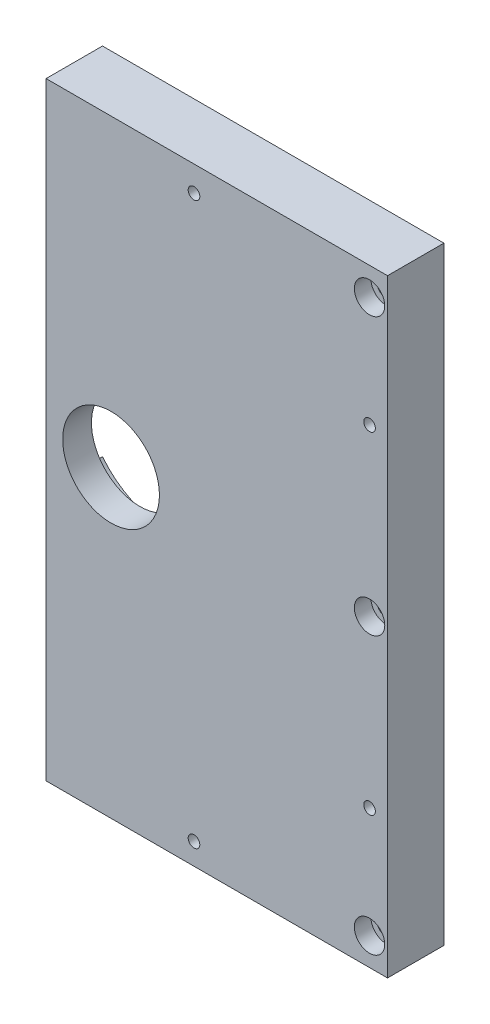
ISO-10303-21;
HEADER;
FILE_DESCRIPTION(('STEP AP214'),'2;1');
FILE_NAME('part.step','',(''),(''),'','','');
FILE_SCHEMA(('AUTOMOTIVE_DESIGN { 1 0 10303 214 1 1 1 1 }'));
ENDSEC;
DATA;
#1=APPLICATION_CONTEXT('core data for automotive mechanical design processes');
#2=APPLICATION_PROTOCOL_DEFINITION('international standard','automotive_design',2000,#1);
#3=PRODUCT_CONTEXT('',#1,'mechanical');
#4=PRODUCT('Part','Part','',(#3));
#5=PRODUCT_RELATED_PRODUCT_CATEGORY('part','',(#4));
#6=PRODUCT_DEFINITION_FORMATION('','',#4);
#7=PRODUCT_DEFINITION_CONTEXT('part definition',#1,'design');
#8=PRODUCT_DEFINITION('design','',#6,#7);
#9=PRODUCT_DEFINITION_SHAPE('','',#8);
#10=(LENGTH_UNIT() NAMED_UNIT(*) SI_UNIT(.MILLI.,.METRE.));
#11=(NAMED_UNIT(*) PLANE_ANGLE_UNIT() SI_UNIT($,.RADIAN.));
#12=(NAMED_UNIT(*) SI_UNIT($,.STERADIAN.) SOLID_ANGLE_UNIT());
#13=UNCERTAINTY_MEASURE_WITH_UNIT(LENGTH_MEASURE(1.E-05),#10,'distance_accuracy_value','');
#14=(GEOMETRIC_REPRESENTATION_CONTEXT(3) GLOBAL_UNCERTAINTY_ASSIGNED_CONTEXT((#13)) GLOBAL_UNIT_ASSIGNED_CONTEXT((#10,
#11,#12)) REPRESENTATION_CONTEXT('',''));
#15=CARTESIAN_POINT('',(0.,0.,0.));
#16=DIRECTION('',(0.,0.,1.));
#17=DIRECTION('',(1.,0.,0.));
#18=AXIS2_PLACEMENT_3D('',#15,#16,#17);
#19=CARTESIAN_POINT('',(0.,0.,20.3999999999999));
#20=DIRECTION('',(0.,0.,-1.));
#21=DIRECTION('',(-1.,0.,0.));
#22=AXIS2_PLACEMENT_3D('',#19,#20,#21);
#23=CYLINDRICAL_SURFACE('',#22,30.);
#24=CARTESIAN_POINT('',(0.,0.,9.99999999999999));
#25=DIRECTION('',(0.,0.,1.));
#26=DIRECTION('',(1.,0.,0.));
#27=AXIS2_PLACEMENT_3D('',#24,#25,#26);
#28=CIRCLE('',#27,30.);
#29=CARTESIAN_POINT('',(-23.5,-18.6480561989715,9.99999999999999));
#30=VERTEX_POINT('',#29);
#31=CARTESIAN_POINT('',(-23.5,18.6480561989715,9.99999999999999));
#32=VERTEX_POINT('',#31);
#33=EDGE_CURVE('E146',#30,#32,#28,.T.);
#34=ORIENTED_EDGE('',*,*,#33,.T.);
#35=DIRECTION('',(0.,0.,-1.));
#36=VECTOR('',#35,1.);
#37=CARTESIAN_POINT('',(-23.5,18.6480561989715,20.3999999999999));
#38=LINE('',#37,#36);
#39=CARTESIAN_POINT('',(-23.5,18.6480561989715,0.));
#40=VERTEX_POINT('',#39);
#41=EDGE_CURVE('E78',#32,#40,#38,.T.);
#42=ORIENTED_EDGE('',*,*,#41,.T.);
#43=CARTESIAN_POINT('',(0.,0.,0.));
#44=DIRECTION('',(0.,0.,-1.));
#45=DIRECTION('',(1.,0.,0.));
#46=AXIS2_PLACEMENT_3D('',#43,#44,#45);
#47=CIRCLE('',#46,30.);
#48=CARTESIAN_POINT('',(-23.5,-18.6480561989715,0.));
#49=VERTEX_POINT('',#48);
#50=EDGE_CURVE('E190',#40,#49,#47,.T.);
#51=ORIENTED_EDGE('',*,*,#50,.T.);
#52=DIRECTION('',(0.,0.,-1.));
#53=VECTOR('',#52,1.);
#54=CARTESIAN_POINT('',(-23.5,-18.6480561989715,20.3999999999999));
#55=LINE('',#54,#53);
#56=EDGE_CURVE('E85',#30,#49,#55,.T.);
#57=ORIENTED_EDGE('',*,*,#56,.F.);
#58=EDGE_LOOP('',(#34,#42,#51,#57));
#59=FACE_BOUND('',#58,.T.);
#60=ADVANCED_FACE('F36',(#59),#23,.F.);
#61=CARTESIAN_POINT('',(-23.5,-110.,20.3999999999999));
#62=DIRECTION('',(0.,1.,0.));
#63=DIRECTION('',(0.,0.,1.));
#64=AXIS2_PLACEMENT_3D('',#61,#62,#63);
#65=PLANE('',#64);
#66=DIRECTION('',(1.,0.,0.));
#67=VECTOR('',#66,1.);
#68=CARTESIAN_POINT('',(-23.5,-110.,0.));
#69=LINE('',#68,#67);
#70=CARTESIAN_POINT('',(-23.5,-110.,0.));
#71=VERTEX_POINT('',#70);
#72=CARTESIAN_POINT('',(100.,-110.,0.));
#73=VERTEX_POINT('',#72);
#74=EDGE_CURVE('E197',#71,#73,#69,.T.);
#75=ORIENTED_EDGE('',*,*,#74,.T.);
#76=DIRECTION('',(0.,0.,-1.));
#77=VECTOR('',#76,1.);
#78=CARTESIAN_POINT('',(100.,-110.,20.3999999999999));
#79=LINE('',#78,#77);
#80=CARTESIAN_POINT('',(100.,-110.,20.3999999999999));
#81=VERTEX_POINT('',#80);
#82=EDGE_CURVE('E45',#81,#73,#79,.T.);
#83=ORIENTED_EDGE('',*,*,#82,.F.);
#84=DIRECTION('',(1.,0.,0.));
#85=VECTOR('',#84,1.);
#86=CARTESIAN_POINT('',(-23.5,-110.,20.3999999999999));
#87=LINE('',#86,#85);
#88=CARTESIAN_POINT('',(-23.5,-110.,20.3999999999999));
#89=VERTEX_POINT('',#88);
#90=EDGE_CURVE('E91',#89,#81,#87,.T.);
#91=ORIENTED_EDGE('',*,*,#90,.F.);
#92=DIRECTION('',(0.,0.,-1.));
#93=VECTOR('',#92,1.);
#94=CARTESIAN_POINT('',(-23.5,-110.,20.3999999999999));
#95=LINE('',#94,#93);
#96=EDGE_CURVE('E11',#89,#71,#95,.T.);
#97=ORIENTED_EDGE('',*,*,#96,.T.);
#98=EDGE_LOOP('',(#75,#83,#91,#97));
#99=FACE_BOUND('',#98,.T.);
#100=ADVANCED_FACE('F38',(#99),#65,.F.);
#101=CARTESIAN_POINT('',(100.,110.,20.3999999999999));
#102=DIRECTION('',(-1.,0.,0.));
#103=DIRECTION('',(0.,-1.,0.));
#104=AXIS2_PLACEMENT_3D('',#101,#102,#103);
#105=PLANE('',#104);
#106=DIRECTION('',(0.,1.,0.));
#107=VECTOR('',#106,1.);
#108=CARTESIAN_POINT('',(100.,110.,0.));
#109=LINE('',#108,#107);
#110=CARTESIAN_POINT('',(100.,110.,0.));
#111=VERTEX_POINT('',#110);
#112=EDGE_CURVE('E199',#73,#111,#109,.T.);
#113=ORIENTED_EDGE('',*,*,#112,.T.);
#114=DIRECTION('',(0.,0.,-1.));
#115=VECTOR('',#114,1.);
#116=CARTESIAN_POINT('',(100.,110.,20.3999999999999));
#117=LINE('',#116,#115);
#118=CARTESIAN_POINT('',(100.,110.,20.3999999999999));
#119=VERTEX_POINT('',#118);
#120=EDGE_CURVE('E210',#119,#111,#117,.T.);
#121=ORIENTED_EDGE('',*,*,#120,.F.);
#122=DIRECTION('',(0.,1.,0.));
#123=VECTOR('',#122,1.);
#124=CARTESIAN_POINT('',(100.,110.,20.3999999999999));
#125=LINE('',#124,#123);
#126=EDGE_CURVE('E192',#81,#119,#125,.T.);
#127=ORIENTED_EDGE('',*,*,#126,.F.);
#128=ORIENTED_EDGE('',*,*,#82,.T.);
#129=EDGE_LOOP('',(#113,#121,#127,#128));
#130=FACE_BOUND('',#129,.T.);
#131=ADVANCED_FACE('F216',(#130),#105,.F.);
#132=CARTESIAN_POINT('',(-23.5,110.,20.3999999999999));
#133=DIRECTION('',(0.,-1.,0.));
#134=DIRECTION('',(0.,0.,-1.));
#135=AXIS2_PLACEMENT_3D('',#132,#133,#134);
#136=PLANE('',#135);
#137=DIRECTION('',(-1.,0.,0.));
#138=VECTOR('',#137,1.);
#139=CARTESIAN_POINT('',(-23.5,110.,0.));
#140=LINE('',#139,#138);
#141=CARTESIAN_POINT('',(-23.5,110.,0.));
#142=VERTEX_POINT('',#141);
#143=EDGE_CURVE('E201',#111,#142,#140,.T.);
#144=ORIENTED_EDGE('',*,*,#143,.T.);
#145=DIRECTION('',(0.,0.,-1.));
#146=VECTOR('',#145,1.);
#147=CARTESIAN_POINT('',(-23.5,110.,20.3999999999999));
#148=LINE('',#147,#146);
#149=CARTESIAN_POINT('',(-23.5,110.,20.3999999999999));
#150=VERTEX_POINT('',#149);
#151=EDGE_CURVE('E208',#150,#142,#148,.T.);
#152=ORIENTED_EDGE('',*,*,#151,.F.);
#153=DIRECTION('',(-1.,0.,0.));
#154=VECTOR('',#153,1.);
#155=CARTESIAN_POINT('',(-23.5,110.,20.3999999999999));
#156=LINE('',#155,#154);
#157=EDGE_CURVE('E194',#119,#150,#156,.T.);
#158=ORIENTED_EDGE('',*,*,#157,.F.);
#159=ORIENTED_EDGE('',*,*,#120,.T.);
#160=EDGE_LOOP('',(#144,#152,#158,#159));
#161=FACE_BOUND('',#160,.T.);
#162=ADVANCED_FACE('F226',(#161),#136,.F.);
#163=CARTESIAN_POINT('',(-23.5,18.6480561989715,20.3999999999999));
#164=DIRECTION('',(1.,0.,0.));
#165=DIRECTION('',(0.,1.,0.));
#166=AXIS2_PLACEMENT_3D('',#163,#164,#165);
#167=PLANE('',#166);
#168=DIRECTION('',(0.,-1.,0.));
#169=VECTOR('',#168,1.);
#170=CARTESIAN_POINT('',(-23.5,18.6480561989715,0.));
#171=LINE('',#170,#169);
#172=EDGE_CURVE('E203',#142,#40,#171,.T.);
#173=ORIENTED_EDGE('',*,*,#172,.T.);
#174=ORIENTED_EDGE('',*,*,#41,.F.);
#175=DIRECTION('',(0.,-1.,0.));
#176=VECTOR('',#175,1.);
#177=CARTESIAN_POINT('',(-23.5,-18.6480561989715,9.99999999999999));
#178=LINE('',#177,#176);
#179=EDGE_CURVE('E150',#32,#30,#178,.T.);
#180=ORIENTED_EDGE('',*,*,#179,.T.);
#181=ORIENTED_EDGE('',*,*,#56,.T.);
#182=DIRECTION('',(0.,-1.,0.));
#183=VECTOR('',#182,1.);
#184=CARTESIAN_POINT('',(-23.5,-110.,0.));
#185=LINE('',#184,#183);
#186=EDGE_CURVE('E188',#49,#71,#185,.T.);
#187=ORIENTED_EDGE('',*,*,#186,.T.);
#188=ORIENTED_EDGE('',*,*,#96,.F.);
#189=DIRECTION('',(0.,-1.,0.));
#190=VECTOR('',#189,1.);
#191=CARTESIAN_POINT('',(-23.5,-110.,20.3999999999999));
#192=LINE('',#191,#190);
#193=EDGE_CURVE('E53',#150,#89,#192,.T.);
#194=ORIENTED_EDGE('',*,*,#193,.F.);
#195=ORIENTED_EDGE('',*,*,#151,.T.);
#196=EDGE_LOOP('',(#173,#174,#180,#181,#187,#188,#194,#195));
#197=FACE_BOUND('',#196,.T.);
#198=ADVANCED_FACE('F228',(#197),#167,.F.);
#199=CARTESIAN_POINT('',(0.,0.,20.3999999999999));
#200=DIRECTION('',(0.,0.,1.));
#201=DIRECTION('',(1.,0.,0.));
#202=AXIS2_PLACEMENT_3D('',#199,#200,#201);
#203=PLANE('',#202);
#204=CARTESIAN_POINT('',(30.,100.827560783671,20.3999999999999));
#205=DIRECTION('',(0.,0.,1.));
#206=DIRECTION('',(1.,0.,0.));
#207=AXIS2_PLACEMENT_3D('',#204,#205,#206);
#208=CIRCLE('',#207,2.09999999999999);
#209=CARTESIAN_POINT('',(32.1,100.827560783671,20.3999999999999));
#210=VERTEX_POINT('',#209);
#211=EDGE_CURVE('E120',#210,#210,#208,.T.);
#212=ORIENTED_EDGE('',*,*,#211,.F.);
#213=EDGE_LOOP('',(#212));
#214=FACE_BOUND('',#213,.T.);
#215=CARTESIAN_POINT('',(93.5,60.,20.3999999999999));
#216=DIRECTION('',(0.,0.,1.));
#217=DIRECTION('',(1.,0.,0.));
#218=AXIS2_PLACEMENT_3D('',#215,#216,#217);
#219=CIRCLE('',#218,2.09999999999999);
#220=CARTESIAN_POINT('',(95.6,60.,20.3999999999999));
#221=VERTEX_POINT('',#220);
#222=EDGE_CURVE('E119',#221,#221,#219,.T.);
#223=ORIENTED_EDGE('',*,*,#222,.F.);
#224=EDGE_LOOP('',(#223));
#225=FACE_BOUND('',#224,.T.);
#226=CARTESIAN_POINT('',(93.5,-60.,20.3999999999999));
#227=DIRECTION('',(0.,0.,1.));
#228=DIRECTION('',(1.,0.,0.));
#229=AXIS2_PLACEMENT_3D('',#226,#227,#228);
#230=CIRCLE('',#229,2.09999999999999);
#231=CARTESIAN_POINT('',(95.6,-60.,20.3999999999999));
#232=VERTEX_POINT('',#231);
#233=EDGE_CURVE('E130',#232,#232,#230,.T.);
#234=ORIENTED_EDGE('',*,*,#233,.F.);
#235=EDGE_LOOP('',(#234));
#236=FACE_BOUND('',#235,.T.);
#237=CARTESIAN_POINT('',(30.,-102.194888390628,20.3999999999999));
#238=DIRECTION('',(0.,0.,1.));
#239=DIRECTION('',(1.,0.,0.));
#240=AXIS2_PLACEMENT_3D('',#237,#238,#239);
#241=CIRCLE('',#240,2.09999999999999);
#242=CARTESIAN_POINT('',(32.1,-102.194888390628,20.3999999999999));
#243=VERTEX_POINT('',#242);
#244=EDGE_CURVE('E136',#243,#243,#241,.T.);
#245=ORIENTED_EDGE('',*,*,#244,.F.);
#246=EDGE_LOOP('',(#245));
#247=FACE_BOUND('',#246,.T.);
#248=CARTESIAN_POINT('',(93.5,100.,20.3999999999999));
#249=DIRECTION('',(0.,0.,1.));
#250=DIRECTION('',(1.,0.,0.));
#251=AXIS2_PLACEMENT_3D('',#248,#249,#250);
#252=CIRCLE('',#251,5.49999999999999);
#253=CARTESIAN_POINT('',(99.,100.,20.3999999999999));
#254=VERTEX_POINT('',#253);
#255=EDGE_CURVE('E152',#254,#254,#252,.T.);
#256=ORIENTED_EDGE('',*,*,#255,.F.);
#257=EDGE_LOOP('',(#256));
#258=FACE_BOUND('',#257,.T.);
#259=CARTESIAN_POINT('',(93.5,0.,20.3999999999999));
#260=DIRECTION('',(0.,0.,1.));
#261=DIRECTION('',(1.,0.,0.));
#262=AXIS2_PLACEMENT_3D('',#259,#260,#261);
#263=CIRCLE('',#262,5.49999999999999);
#264=CARTESIAN_POINT('',(99.,0.,20.3999999999999));
#265=VERTEX_POINT('',#264);
#266=EDGE_CURVE('E164',#265,#265,#263,.T.);
#267=ORIENTED_EDGE('',*,*,#266,.F.);
#268=EDGE_LOOP('',(#267));
#269=FACE_BOUND('',#268,.T.);
#270=CARTESIAN_POINT('',(93.5,-100.,20.3999999999999));
#271=DIRECTION('',(0.,0.,1.));
#272=DIRECTION('',(1.,0.,0.));
#273=AXIS2_PLACEMENT_3D('',#270,#271,#272);
#274=CIRCLE('',#273,5.49999999999999);
#275=CARTESIAN_POINT('',(99.,-100.,20.3999999999999));
#276=VERTEX_POINT('',#275);
#277=EDGE_CURVE('E176',#276,#276,#274,.T.);
#278=ORIENTED_EDGE('',*,*,#277,.F.);
#279=EDGE_LOOP('',(#278));
#280=FACE_BOUND('',#279,.T.);
#281=ORIENTED_EDGE('',*,*,#193,.T.);
#282=ORIENTED_EDGE('',*,*,#90,.T.);
#283=ORIENTED_EDGE('',*,*,#126,.T.);
#284=ORIENTED_EDGE('',*,*,#157,.T.);
#285=EDGE_LOOP('',(#281,#282,#283,#284));
#286=FACE_BOUND('',#285,.T.);
#287=CARTESIAN_POINT('',(0.,0.,20.3999999999999));
#288=DIRECTION('',(0.,0.,1.));
#289=DIRECTION('',(1.,0.,0.));
#290=AXIS2_PLACEMENT_3D('',#287,#288,#289);
#291=CIRCLE('',#290,17.5);
#292=CARTESIAN_POINT('',(17.5,0.,20.3999999999999));
#293=VERTEX_POINT('',#292);
#294=EDGE_CURVE('E143',#293,#293,#291,.T.);
#295=ORIENTED_EDGE('',*,*,#294,.F.);
#296=EDGE_LOOP('',(#295));
#297=FACE_BOUND('',#296,.T.);
#298=ADVANCED_FACE('F259',(#214,#225,#236,#247,#258,#269,#280,#286,#297),#203,.T.);
#299=CARTESIAN_POINT('',(0.,0.,0.));
#300=DIRECTION('',(0.,0.,1.));
#301=DIRECTION('',(1.,0.,0.));
#302=AXIS2_PLACEMENT_3D('',#299,#300,#301);
#303=PLANE('',#302);
#304=CARTESIAN_POINT('',(93.5,100.,0.));
#305=DIRECTION('',(0.,0.,1.));
#306=DIRECTION('',(1.,0.,0.));
#307=AXIS2_PLACEMENT_3D('',#304,#305,#306);
#308=CIRCLE('',#307,3.3);
#309=CARTESIAN_POINT('',(96.8,100.,0.));
#310=VERTEX_POINT('',#309);
#311=EDGE_CURVE('E161',#310,#310,#308,.T.);
#312=ORIENTED_EDGE('',*,*,#311,.T.);
#313=EDGE_LOOP('',(#312));
#314=FACE_BOUND('',#313,.T.);
#315=CARTESIAN_POINT('',(93.5,0.,0.));
#316=DIRECTION('',(0.,0.,1.));
#317=DIRECTION('',(1.,0.,0.));
#318=AXIS2_PLACEMENT_3D('',#315,#316,#317);
#319=CIRCLE('',#318,3.3);
#320=CARTESIAN_POINT('',(96.8,0.,0.));
#321=VERTEX_POINT('',#320);
#322=EDGE_CURVE('E173',#321,#321,#319,.T.);
#323=ORIENTED_EDGE('',*,*,#322,.T.);
#324=EDGE_LOOP('',(#323));
#325=FACE_BOUND('',#324,.T.);
#326=CARTESIAN_POINT('',(93.5,-100.,0.));
#327=DIRECTION('',(0.,0.,1.));
#328=DIRECTION('',(1.,0.,0.));
#329=AXIS2_PLACEMENT_3D('',#326,#327,#328);
#330=CIRCLE('',#329,3.3);
#331=CARTESIAN_POINT('',(96.8,-100.,0.));
#332=VERTEX_POINT('',#331);
#333=EDGE_CURVE('E185',#332,#332,#330,.T.);
#334=ORIENTED_EDGE('',*,*,#333,.T.);
#335=EDGE_LOOP('',(#334));
#336=FACE_BOUND('',#335,.T.);
#337=ORIENTED_EDGE('',*,*,#186,.F.);
#338=ORIENTED_EDGE('',*,*,#50,.F.);
#339=ORIENTED_EDGE('',*,*,#172,.F.);
#340=ORIENTED_EDGE('',*,*,#143,.F.);
#341=ORIENTED_EDGE('',*,*,#112,.F.);
#342=ORIENTED_EDGE('',*,*,#74,.F.);
#343=EDGE_LOOP('',(#337,#338,#339,#340,#341,#342));
#344=FACE_BOUND('',#343,.T.);
#345=ADVANCED_FACE('F221',(#314,#325,#336,#344),#303,.F.);
#346=CARTESIAN_POINT('',(93.5,-100.,20.3999999999999));
#347=DIRECTION('',(0.,0.,1.));
#348=DIRECTION('',(1.,0.,0.));
#349=AXIS2_PLACEMENT_3D('',#346,#347,#348);
#350=CYLINDRICAL_SURFACE('',#349,3.3);
#351=ORIENTED_EDGE('',*,*,#333,.F.);
#352=EDGE_LOOP('',(#351));
#353=FACE_BOUND('',#352,.T.);
#354=CARTESIAN_POINT('',(93.5,-100.,14.3999999999999));
#355=DIRECTION('',(0.,0.,1.));
#356=DIRECTION('',(1.,0.,0.));
#357=AXIS2_PLACEMENT_3D('',#354,#355,#356);
#358=CIRCLE('',#357,3.3);
#359=CARTESIAN_POINT('',(96.8,-100.,14.3999999999999));
#360=VERTEX_POINT('',#359);
#361=EDGE_CURVE('E182',#360,#360,#358,.T.);
#362=ORIENTED_EDGE('',*,*,#361,.T.);
#363=EDGE_LOOP('',(#362));
#364=FACE_BOUND('',#363,.T.);
#365=ADVANCED_FACE('F288',(#353,#364),#350,.F.);
#366=CARTESIAN_POINT('',(96.8,-100.,14.3999999999999));
#367=DIRECTION('',(0.,0.,-1.));
#368=DIRECTION('',(-1.,0.,0.));
#369=AXIS2_PLACEMENT_3D('',#366,#367,#368);
#370=PLANE('',#369);
#371=ORIENTED_EDGE('',*,*,#361,.F.);
#372=EDGE_LOOP('',(#371));
#373=FACE_BOUND('',#372,.T.);
#374=CARTESIAN_POINT('',(93.5,-100.,14.3999999999999));
#375=DIRECTION('',(0.,0.,1.));
#376=DIRECTION('',(1.,0.,0.));
#377=AXIS2_PLACEMENT_3D('',#374,#375,#376);
#378=CIRCLE('',#377,5.49999999999999);
#379=CARTESIAN_POINT('',(99.,-100.,14.3999999999999));
#380=VERTEX_POINT('',#379);
#381=EDGE_CURVE('E179',#380,#380,#378,.T.);
#382=ORIENTED_EDGE('',*,*,#381,.T.);
#383=EDGE_LOOP('',(#382));
#384=FACE_BOUND('',#383,.T.);
#385=ADVANCED_FACE('F295',(#373,#384),#370,.F.);
#386=CARTESIAN_POINT('',(93.5,-100.,20.3999999999999));
#387=DIRECTION('',(0.,0.,1.));
#388=DIRECTION('',(1.,0.,0.));
#389=AXIS2_PLACEMENT_3D('',#386,#387,#388);
#390=CYLINDRICAL_SURFACE('',#389,5.49999999999999);
#391=ORIENTED_EDGE('',*,*,#381,.F.);
#392=EDGE_LOOP('',(#391));
#393=FACE_BOUND('',#392,.T.);
#394=ORIENTED_EDGE('',*,*,#277,.T.);
#395=EDGE_LOOP('',(#394));
#396=FACE_BOUND('',#395,.T.);
#397=ADVANCED_FACE('F303',(#393,#396),#390,.F.);
#398=CARTESIAN_POINT('',(93.5,0.,20.3999999999999));
#399=DIRECTION('',(0.,0.,1.));
#400=DIRECTION('',(1.,0.,0.));
#401=AXIS2_PLACEMENT_3D('',#398,#399,#400);
#402=CYLINDRICAL_SURFACE('',#401,3.3);
#403=ORIENTED_EDGE('',*,*,#322,.F.);
#404=EDGE_LOOP('',(#403));
#405=FACE_BOUND('',#404,.T.);
#406=CARTESIAN_POINT('',(93.5,0.,14.3999999999999));
#407=DIRECTION('',(0.,0.,1.));
#408=DIRECTION('',(1.,0.,0.));
#409=AXIS2_PLACEMENT_3D('',#406,#407,#408);
#410=CIRCLE('',#409,3.3);
#411=CARTESIAN_POINT('',(96.8,0.,14.3999999999999));
#412=VERTEX_POINT('',#411);
#413=EDGE_CURVE('E170',#412,#412,#410,.T.);
#414=ORIENTED_EDGE('',*,*,#413,.T.);
#415=EDGE_LOOP('',(#414));
#416=FACE_BOUND('',#415,.T.);
#417=ADVANCED_FACE('F311',(#405,#416),#402,.F.);
#418=CARTESIAN_POINT('',(96.8,0.,14.3999999999999));
#419=DIRECTION('',(0.,0.,-1.));
#420=DIRECTION('',(-1.,0.,0.));
#421=AXIS2_PLACEMENT_3D('',#418,#419,#420);
#422=PLANE('',#421);
#423=ORIENTED_EDGE('',*,*,#413,.F.);
#424=EDGE_LOOP('',(#423));
#425=FACE_BOUND('',#424,.T.);
#426=CARTESIAN_POINT('',(93.5,0.,14.3999999999999));
#427=DIRECTION('',(0.,0.,1.));
#428=DIRECTION('',(1.,0.,0.));
#429=AXIS2_PLACEMENT_3D('',#426,#427,#428);
#430=CIRCLE('',#429,5.49999999999999);
#431=CARTESIAN_POINT('',(99.,0.,14.3999999999999));
#432=VERTEX_POINT('',#431);
#433=EDGE_CURVE('E167',#432,#432,#430,.T.);
#434=ORIENTED_EDGE('',*,*,#433,.T.);
#435=EDGE_LOOP('',(#434));
#436=FACE_BOUND('',#435,.T.);
#437=ADVANCED_FACE('F319',(#425,#436),#422,.F.);
#438=CARTESIAN_POINT('',(93.5,0.,20.3999999999999));
#439=DIRECTION('',(0.,0.,1.));
#440=DIRECTION('',(1.,0.,0.));
#441=AXIS2_PLACEMENT_3D('',#438,#439,#440);
#442=CYLINDRICAL_SURFACE('',#441,5.49999999999999);
#443=ORIENTED_EDGE('',*,*,#433,.F.);
#444=EDGE_LOOP('',(#443));
#445=FACE_BOUND('',#444,.T.);
#446=ORIENTED_EDGE('',*,*,#266,.T.);
#447=EDGE_LOOP('',(#446));
#448=FACE_BOUND('',#447,.T.);
#449=ADVANCED_FACE('F327',(#445,#448),#442,.F.);
#450=CARTESIAN_POINT('',(93.5,100.,20.3999999999999));
#451=DIRECTION('',(0.,0.,1.));
#452=DIRECTION('',(1.,0.,0.));
#453=AXIS2_PLACEMENT_3D('',#450,#451,#452);
#454=CYLINDRICAL_SURFACE('',#453,3.3);
#455=ORIENTED_EDGE('',*,*,#311,.F.);
#456=EDGE_LOOP('',(#455));
#457=FACE_BOUND('',#456,.T.);
#458=CARTESIAN_POINT('',(93.5,100.,14.3999999999999));
#459=DIRECTION('',(0.,0.,1.));
#460=DIRECTION('',(1.,0.,0.));
#461=AXIS2_PLACEMENT_3D('',#458,#459,#460);
#462=CIRCLE('',#461,3.3);
#463=CARTESIAN_POINT('',(96.8,100.,14.3999999999999));
#464=VERTEX_POINT('',#463);
#465=EDGE_CURVE('E158',#464,#464,#462,.T.);
#466=ORIENTED_EDGE('',*,*,#465,.T.);
#467=EDGE_LOOP('',(#466));
#468=FACE_BOUND('',#467,.T.);
#469=ADVANCED_FACE('F335',(#457,#468),#454,.F.);
#470=CARTESIAN_POINT('',(96.8,100.,14.3999999999999));
#471=DIRECTION('',(0.,0.,-1.));
#472=DIRECTION('',(-1.,0.,0.));
#473=AXIS2_PLACEMENT_3D('',#470,#471,#472);
#474=PLANE('',#473);
#475=ORIENTED_EDGE('',*,*,#465,.F.);
#476=EDGE_LOOP('',(#475));
#477=FACE_BOUND('',#476,.T.);
#478=CARTESIAN_POINT('',(93.5,100.,14.3999999999999));
#479=DIRECTION('',(0.,0.,1.));
#480=DIRECTION('',(1.,0.,0.));
#481=AXIS2_PLACEMENT_3D('',#478,#479,#480);
#482=CIRCLE('',#481,5.49999999999999);
#483=CARTESIAN_POINT('',(99.,100.,14.3999999999999));
#484=VERTEX_POINT('',#483);
#485=EDGE_CURVE('E155',#484,#484,#482,.T.);
#486=ORIENTED_EDGE('',*,*,#485,.T.);
#487=EDGE_LOOP('',(#486));
#488=FACE_BOUND('',#487,.T.);
#489=ADVANCED_FACE('F343',(#477,#488),#474,.F.);
#490=CARTESIAN_POINT('',(93.5,100.,20.3999999999999));
#491=DIRECTION('',(0.,0.,1.));
#492=DIRECTION('',(1.,0.,0.));
#493=AXIS2_PLACEMENT_3D('',#490,#491,#492);
#494=CYLINDRICAL_SURFACE('',#493,5.49999999999999);
#495=ORIENTED_EDGE('',*,*,#485,.F.);
#496=EDGE_LOOP('',(#495));
#497=FACE_BOUND('',#496,.T.);
#498=ORIENTED_EDGE('',*,*,#255,.T.);
#499=EDGE_LOOP('',(#498));
#500=FACE_BOUND('',#499,.T.);
#501=ADVANCED_FACE('F235',(#497,#500),#494,.F.);
#502=CARTESIAN_POINT('',(0.,0.,9.99999999999999));
#503=DIRECTION('',(0.,0.,1.));
#504=DIRECTION('',(1.,0.,0.));
#505=AXIS2_PLACEMENT_3D('',#502,#503,#504);
#506=PLANE('',#505);
#507=ORIENTED_EDGE('',*,*,#33,.F.);
#508=ORIENTED_EDGE('',*,*,#179,.F.);
#509=EDGE_LOOP('',(#507,#508));
#510=FACE_BOUND('',#509,.T.);
#511=CARTESIAN_POINT('',(0.,0.,9.99999999999999));
#512=DIRECTION('',(0.,0.,1.));
#513=DIRECTION('',(1.,0.,0.));
#514=AXIS2_PLACEMENT_3D('',#511,#512,#513);
#515=CIRCLE('',#514,17.5);
#516=CARTESIAN_POINT('',(17.5,0.,9.99999999999999));
#517=VERTEX_POINT('',#516);
#518=EDGE_CURVE('E142',#517,#517,#515,.T.);
#519=ORIENTED_EDGE('',*,*,#518,.T.);
#520=EDGE_LOOP('',(#519));
#521=FACE_BOUND('',#520,.T.);
#522=ADVANCED_FACE('F231',(#510,#521),#506,.F.);
#523=CARTESIAN_POINT('',(0.,0.,20.3999999999999));
#524=DIRECTION('',(0.,0.,-1.));
#525=DIRECTION('',(-1.,0.,0.));
#526=AXIS2_PLACEMENT_3D('',#523,#524,#525);
#527=CYLINDRICAL_SURFACE('',#526,17.5);
#528=ORIENTED_EDGE('',*,*,#294,.T.);
#529=EDGE_LOOP('',(#528));
#530=FACE_BOUND('',#529,.T.);
#531=ORIENTED_EDGE('',*,*,#518,.F.);
#532=EDGE_LOOP('',(#531));
#533=FACE_BOUND('',#532,.T.);
#534=ADVANCED_FACE('F234',(#530,#533),#527,.F.);
#535=CARTESIAN_POINT('',(30.,-102.194888390628,6.39999999999989));
#536=DIRECTION('',(0.,0.,1.));
#537=DIRECTION('',(1.,0.,0.));
#538=AXIS2_PLACEMENT_3D('',#535,#536,#537);
#539=CONICAL_SURFACE('',#538,2.09999999999999,1.02974425867665);
#540=CARTESIAN_POINT('',(30.,-102.194888390628,5.13819270004201));
#541=VERTEX_POINT('',#540);
#542=VERTEX_LOOP('',#541);
#543=FACE_BOUND('',#542,.T.);
#544=CARTESIAN_POINT('',(30.,-102.194888390628,6.39999999999989));
#545=DIRECTION('',(0.,0.,1.));
#546=DIRECTION('',(1.,0.,0.));
#547=AXIS2_PLACEMENT_3D('',#544,#545,#546);
#548=CIRCLE('',#547,2.09999999999999);
#549=CARTESIAN_POINT('',(32.1,-102.194888390628,6.39999999999989));
#550=VERTEX_POINT('',#549);
#551=EDGE_CURVE('E139',#550,#550,#548,.T.);
#552=ORIENTED_EDGE('',*,*,#551,.T.);
#553=EDGE_LOOP('',(#552));
#554=FACE_BOUND('',#553,.T.);
#555=ADVANCED_FACE('F240',(#543,#554),#539,.F.);
#556=CARTESIAN_POINT('',(30.,-102.194888390628,20.3999999999999));
#557=DIRECTION('',(0.,0.,1.));
#558=DIRECTION('',(1.,0.,0.));
#559=AXIS2_PLACEMENT_3D('',#556,#557,#558);
#560=CYLINDRICAL_SURFACE('',#559,2.09999999999999);
#561=ORIENTED_EDGE('',*,*,#551,.F.);
#562=EDGE_LOOP('',(#561));
#563=FACE_BOUND('',#562,.T.);
#564=ORIENTED_EDGE('',*,*,#244,.T.);
#565=EDGE_LOOP('',(#564));
#566=FACE_BOUND('',#565,.T.);
#567=ADVANCED_FACE('F246',(#563,#566),#560,.F.);
#568=CARTESIAN_POINT('',(93.5,-60.,6.39999999999989));
#569=DIRECTION('',(0.,0.,1.));
#570=DIRECTION('',(1.,0.,0.));
#571=AXIS2_PLACEMENT_3D('',#568,#569,#570);
#572=CONICAL_SURFACE('',#571,2.09999999999999,1.02974425867665);
#573=CARTESIAN_POINT('',(93.5,-60.,5.13819270004201));
#574=VERTEX_POINT('',#573);
#575=VERTEX_LOOP('',#574);
#576=FACE_BOUND('',#575,.T.);
#577=CARTESIAN_POINT('',(93.5,-60.,6.39999999999989));
#578=DIRECTION('',(0.,0.,1.));
#579=DIRECTION('',(1.,0.,0.));
#580=AXIS2_PLACEMENT_3D('',#577,#578,#579);
#581=CIRCLE('',#580,2.09999999999999);
#582=CARTESIAN_POINT('',(95.6,-60.,6.39999999999989));
#583=VERTEX_POINT('',#582);
#584=EDGE_CURVE('E133',#583,#583,#581,.T.);
#585=ORIENTED_EDGE('',*,*,#584,.T.);
#586=EDGE_LOOP('',(#585));
#587=FACE_BOUND('',#586,.T.);
#588=ADVANCED_FACE('F380',(#576,#587),#572,.F.);
#589=CARTESIAN_POINT('',(93.5,-60.,20.3999999999999));
#590=DIRECTION('',(0.,0.,1.));
#591=DIRECTION('',(1.,0.,0.));
#592=AXIS2_PLACEMENT_3D('',#589,#590,#591);
#593=CYLINDRICAL_SURFACE('',#592,2.09999999999999);
#594=ORIENTED_EDGE('',*,*,#584,.F.);
#595=EDGE_LOOP('',(#594));
#596=FACE_BOUND('',#595,.T.);
#597=ORIENTED_EDGE('',*,*,#233,.T.);
#598=EDGE_LOOP('',(#597));
#599=FACE_BOUND('',#598,.T.);
#600=ADVANCED_FACE('F390',(#596,#599),#593,.F.);
#601=CARTESIAN_POINT('',(93.5,60.,6.39999999999989));
#602=DIRECTION('',(0.,0.,1.));
#603=DIRECTION('',(1.,0.,0.));
#604=AXIS2_PLACEMENT_3D('',#601,#602,#603);
#605=CONICAL_SURFACE('',#604,2.09999999999999,1.02974425867665);
#606=CARTESIAN_POINT('',(93.5,60.,5.13819270004201));
#607=VERTEX_POINT('',#606);
#608=VERTEX_LOOP('',#607);
#609=FACE_BOUND('',#608,.T.);
#610=CARTESIAN_POINT('',(93.5,60.,6.39999999999989));
#611=DIRECTION('',(0.,0.,1.));
#612=DIRECTION('',(1.,0.,0.));
#613=AXIS2_PLACEMENT_3D('',#610,#611,#612);
#614=CIRCLE('',#613,2.09999999999999);
#615=CARTESIAN_POINT('',(95.6,60.,6.39999999999989));
#616=VERTEX_POINT('',#615);
#617=EDGE_CURVE('E123',#616,#616,#614,.T.);
#618=ORIENTED_EDGE('',*,*,#617,.T.);
#619=EDGE_LOOP('',(#618));
#620=FACE_BOUND('',#619,.T.);
#621=ADVANCED_FACE('F399',(#609,#620),#605,.F.);
#622=CARTESIAN_POINT('',(93.5,60.,20.3999999999999));
#623=DIRECTION('',(0.,0.,1.));
#624=DIRECTION('',(1.,0.,0.));
#625=AXIS2_PLACEMENT_3D('',#622,#623,#624);
#626=CYLINDRICAL_SURFACE('',#625,2.09999999999999);
#627=ORIENTED_EDGE('',*,*,#617,.F.);
#628=EDGE_LOOP('',(#627));
#629=FACE_BOUND('',#628,.T.);
#630=ORIENTED_EDGE('',*,*,#222,.T.);
#631=EDGE_LOOP('',(#630));
#632=FACE_BOUND('',#631,.T.);
#633=ADVANCED_FACE('F113',(#629,#632),#626,.F.);
#634=CARTESIAN_POINT('',(30.,100.827560783671,6.39999999999989));
#635=DIRECTION('',(0.,0.,1.));
#636=DIRECTION('',(1.,0.,0.));
#637=AXIS2_PLACEMENT_3D('',#634,#635,#636);
#638=CONICAL_SURFACE('',#637,2.09999999999999,1.02974425867665);
#639=CARTESIAN_POINT('',(30.,100.827560783671,5.13819270004201));
#640=VERTEX_POINT('',#639);
#641=VERTEX_LOOP('',#640);
#642=FACE_BOUND('',#641,.T.);
#643=CARTESIAN_POINT('',(30.,100.827560783671,6.39999999999989));
#644=DIRECTION('',(0.,0.,1.));
#645=DIRECTION('',(1.,0.,0.));
#646=AXIS2_PLACEMENT_3D('',#643,#644,#645);
#647=CIRCLE('',#646,2.09999999999999);
#648=CARTESIAN_POINT('',(32.1,100.827560783671,6.39999999999989));
#649=VERTEX_POINT('',#648);
#650=EDGE_CURVE('E117',#649,#649,#647,.T.);
#651=ORIENTED_EDGE('',*,*,#650,.T.);
#652=EDGE_LOOP('',(#651));
#653=FACE_BOUND('',#652,.T.);
#654=ADVANCED_FACE('F109',(#642,#653),#638,.F.);
#655=CARTESIAN_POINT('',(30.,100.827560783671,20.3999999999999));
#656=DIRECTION('',(0.,0.,1.));
#657=DIRECTION('',(1.,0.,0.));
#658=AXIS2_PLACEMENT_3D('',#655,#656,#657);
#659=CYLINDRICAL_SURFACE('',#658,2.09999999999999);
#660=ORIENTED_EDGE('',*,*,#650,.F.);
#661=EDGE_LOOP('',(#660));
#662=FACE_BOUND('',#661,.T.);
#663=ORIENTED_EDGE('',*,*,#211,.T.);
#664=EDGE_LOOP('',(#663));
#665=FACE_BOUND('',#664,.T.);
#666=ADVANCED_FACE('F112',(#662,#665),#659,.F.);
#667=CLOSED_SHELL('',(#60,#100,#131,#162,#198,#298,#345,#365,#385,#397,#417,#437,#449,#469,#489,
#501,#522,#534,#555,#567,#588,#600,#621,#633,#654,#666));
#668=MANIFOLD_SOLID_BREP('B2',#667);
#669=ADVANCED_BREP_SHAPE_REPRESENTATION('',(#18,#668),#14);
#670=SHAPE_DEFINITION_REPRESENTATION(#9,#669);
ENDSEC;
END-ISO-10303-21;
